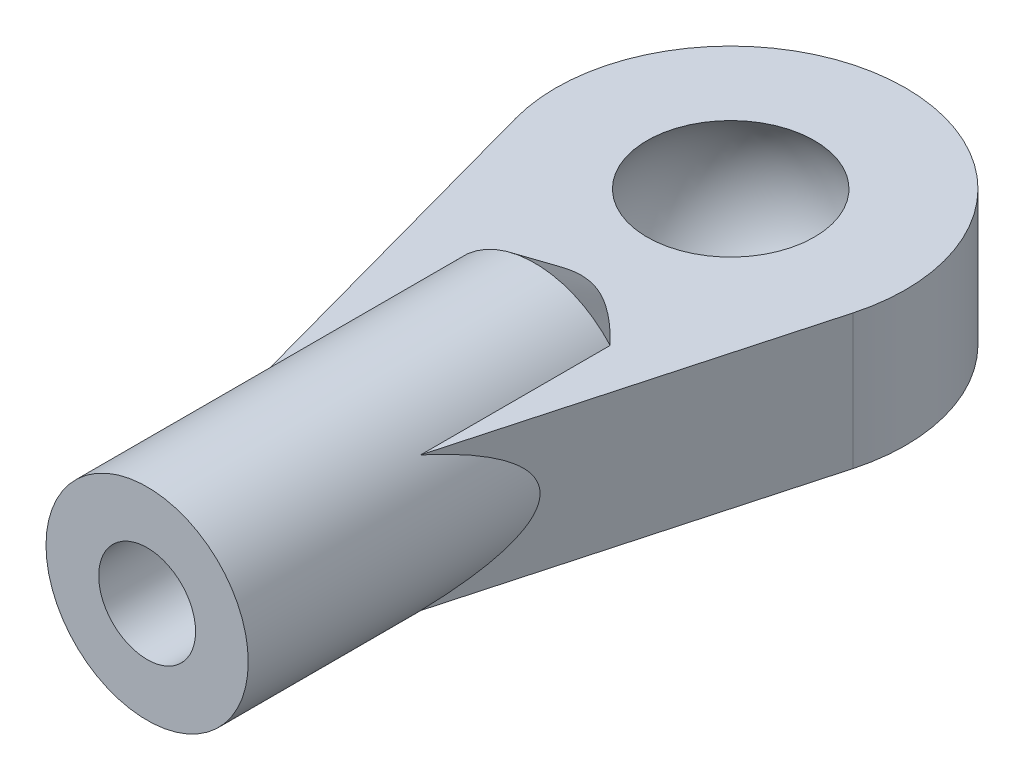
ISO-10303-21;
HEADER;
FILE_DESCRIPTION(('STEP AP214'),'2;1');
FILE_NAME('part.step','',(''),(''),'','','');
FILE_SCHEMA(('AUTOMOTIVE_DESIGN { 1 0 10303 214 1 1 1 1 }'));
ENDSEC;
DATA;
#1=APPLICATION_CONTEXT('core data for automotive mechanical design processes');
#2=APPLICATION_PROTOCOL_DEFINITION('international standard','automotive_design',2000,#1);
#3=PRODUCT_CONTEXT('',#1,'mechanical');
#4=PRODUCT('Part','Part','',(#3));
#5=PRODUCT_RELATED_PRODUCT_CATEGORY('part','',(#4));
#6=PRODUCT_DEFINITION_FORMATION('','',#4);
#7=PRODUCT_DEFINITION_CONTEXT('part definition',#1,'design');
#8=PRODUCT_DEFINITION('design','',#6,#7);
#9=PRODUCT_DEFINITION_SHAPE('','',#8);
#10=(LENGTH_UNIT() NAMED_UNIT(*) SI_UNIT(.MILLI.,.METRE.));
#11=(NAMED_UNIT(*) PLANE_ANGLE_UNIT() SI_UNIT($,.RADIAN.));
#12=(NAMED_UNIT(*) SI_UNIT($,.STERADIAN.) SOLID_ANGLE_UNIT());
#13=UNCERTAINTY_MEASURE_WITH_UNIT(LENGTH_MEASURE(1.E-05),#10,'distance_accuracy_value','');
#14=(GEOMETRIC_REPRESENTATION_CONTEXT(3) GLOBAL_UNCERTAINTY_ASSIGNED_CONTEXT((#13)) GLOBAL_UNIT_ASSIGNED_CONTEXT((#10,
#11,#12)) REPRESENTATION_CONTEXT('',''));
#15=CARTESIAN_POINT('',(0.,0.,0.));
#16=DIRECTION('',(0.,0.,1.));
#17=DIRECTION('',(1.,0.,0.));
#18=AXIS2_PLACEMENT_3D('',#15,#16,#17);
#19=CARTESIAN_POINT('',(1.98557296516648,1.6,0.));
#20=DIRECTION('',(0.,1.,0.));
#21=DIRECTION('',(0.,0.,1.));
#22=AXIS2_PLACEMENT_3D('',#19,#20,#21);
#23=PLANE('',#22);
#24=CARTESIAN_POINT('',(0.,1.6,0.));
#25=DIRECTION('',(0.,-1.,0.));
#26=DIRECTION('',(0.,0.,-1.));
#27=AXIS2_PLACEMENT_3D('',#24,#25,#26);
#28=CIRCLE('',#27,1.98557296516648);
#29=CARTESIAN_POINT('',(1.98557296516648,1.6,0.));
#30=VERTEX_POINT('',#29);
#31=EDGE_CURVE('E11',#30,#30,#28,.T.);
#32=ORIENTED_EDGE('',*,*,#31,.T.);
#33=EDGE_LOOP('',(#32));
#34=FACE_BOUND('',#33,.T.);
#35=DIRECTION('',(0.265108345024584,0.,0.964218629460314));
#36=VECTOR('',#35,1.);
#37=CARTESIAN_POINT('',(-2.4,1.6,6.925));
#38=LINE('',#37,#36);
#39=CARTESIAN_POINT('',(-4.0015073122603,1.6,1.10019963185203));
#40=VERTEX_POINT('',#39);
#41=CARTESIAN_POINT('',(-1.78885438199983,1.6,9.14778174658798));
#42=VERTEX_POINT('',#41);
#43=EDGE_CURVE('E145',#40,#42,#38,.T.);
#44=ORIENTED_EDGE('',*,*,#43,.T.);
#45=DIRECTION('',(0.,0.,1.));
#46=VECTOR('',#45,1.);
#47=CARTESIAN_POINT('',(-1.78885438199983,1.6,4.65));
#48=LINE('',#47,#46);
#49=CARTESIAN_POINT('',(-1.78885438199983,1.6,4.65));
#50=VERTEX_POINT('',#49);
#51=EDGE_CURVE('E148',#50,#42,#48,.T.);
#52=ORIENTED_EDGE('',*,*,#51,.F.);
#53=CARTESIAN_POINT('',(-3.32809527422648,1.6,6.42928336076321));
#54=CARTESIAN_POINT('',(-3.25740840476749,1.6,6.34160885984183));
#55=CARTESIAN_POINT('',(-3.18647464317426,1.6,6.25413191136492));
#56=CARTESIAN_POINT('',(-3.04398797565905,1.6,6.07967406521055));
#57=CARTESIAN_POINT('',(-2.97243502802624,1.6,5.99269320161656));
#58=CARTESIAN_POINT('',(-2.82839579161192,1.6,5.81910129645158));
#59=CARTESIAN_POINT('',(-2.75590747260073,1.6,5.73249193702244));
#60=CARTESIAN_POINT('',(-2.61002729059965,1.6,5.56004115878007));
#61=CARTESIAN_POINT('',(-2.53663545640642,1.6,5.47419971564175));
#62=CARTESIAN_POINT('',(-2.38535254436316,1.6,5.29959132057733));
#63=CARTESIAN_POINT('',(-2.30740901985387,1.6,5.21086970814048));
#64=CARTESIAN_POINT('',(-2.14995912885733,1.6,5.03482530272149));
#65=CARTESIAN_POINT('',(-2.07045282166961,1.6,4.94750245689071));
#66=CARTESIAN_POINT('',(-1.90949586266849,1.6,4.77485038968697));
#67=CARTESIAN_POINT('',(-1.82804757844161,1.6,4.6895189688683));
#68=CARTESIAN_POINT('',(-1.66246306648709,1.6,4.52151609669431));
#69=CARTESIAN_POINT('',(-1.57832743738984,1.6,4.4388440610596));
#70=CARTESIAN_POINT('',(-1.43282584739156,1.6,4.30225482490929));
#71=CARTESIAN_POINT('',(-1.37242074315023,1.6,4.24731799266033));
#72=CARTESIAN_POINT('',(-1.24934790906652,1.6,4.1399581127653));
#73=CARTESIAN_POINT('',(-1.18667912103876,1.6,4.08753626814962));
#74=CARTESIAN_POINT('',(-1.05893880870653,1.6,3.98655086785192));
#75=CARTESIAN_POINT('',(-0.993885540746542,1.6,3.93796445719715));
#76=CARTESIAN_POINT('',(-0.860343771627839,1.6,3.84581392290894));
#77=CARTESIAN_POINT('',(-0.791858657817134,1.6,3.80224498172568));
#78=CARTESIAN_POINT('',(-0.652735864121901,1.6,3.72354564303423));
#79=CARTESIAN_POINT('',(-0.582218452038707,1.6,3.68820693062372));
#80=CARTESIAN_POINT('',(-0.436900702576425,1.6,3.62755031199775));
#81=CARTESIAN_POINT('',(-0.362106705198783,1.6,3.60221799081262));
#82=CARTESIAN_POINT('',(-0.246797039780545,1.6,3.57431258554671));
#83=CARTESIAN_POINT('',(-0.207492539865301,1.6,3.56667242186748));
#84=CARTESIAN_POINT('',(-0.128330919765842,1.6,3.55530396031901));
#85=CARTESIAN_POINT('',(-0.0884741260761729,1.6,3.55157344346073));
#86=CARTESIAN_POINT('',(-0.00863613212186914,1.6,3.54824311424331));
#87=CARTESIAN_POINT('',(0.0313448395711053,1.6,3.54863794758123));
#88=CARTESIAN_POINT('',(0.111046985817861,1.6,3.55350925089506));
#89=CARTESIAN_POINT('',(0.150768133308623,1.6,3.55798613944418));
#90=CARTESIAN_POINT('',(0.27175498526633,1.6,3.5776651474584));
#91=CARTESIAN_POINT('',(0.352042784804189,1.6,3.5992164521965));
#92=CARTESIAN_POINT('',(0.468998001759893,1.6,3.64095434469174));
#93=CARTESIAN_POINT('',(0.50749108178793,1.6,3.65648372316395));
#94=CARTESIAN_POINT('',(0.583322079504167,1.6,3.69016822794667));
#95=CARTESIAN_POINT('',(0.620660008265836,1.6,3.70832332907709));
#96=CARTESIAN_POINT('',(0.749464996281795,1.6,3.77567872359347));
#97=CARTESIAN_POINT('',(0.837960238560091,1.6,3.83053502304846));
#98=CARTESIAN_POINT('',(1.00932815879972,1.6,3.94846041716161));
#99=CARTESIAN_POINT('',(1.09218801411238,1.6,4.01154734719936));
#100=CARTESIAN_POINT('',(1.25470334592205,1.6,4.14380142496116));
#101=CARTESIAN_POINT('',(1.3343016682226,1.6,4.21303818148327));
#102=CARTESIAN_POINT('',(1.45119263342751,1.6,4.3195147870875));
#103=CARTESIAN_POINT('',(1.48971934732714,1.6,4.35542474250267));
#104=CARTESIAN_POINT('',(1.56606122762418,1.6,4.42799187791643));
#105=CARTESIAN_POINT('',(1.60387642248238,1.6,4.46464902790449));
#106=CARTESIAN_POINT('',(1.72985279044113,1.6,4.5888036187823));
#107=CARTESIAN_POINT('',(1.81661943048353,1.6,4.67771530081166));
#108=CARTESIAN_POINT('',(1.98767537623552,1.6,4.85789768536102));
#109=CARTESIAN_POINT('',(2.07196425963643,1.6,4.94916878509477));
#110=CARTESIAN_POINT('',(2.23871053136241,1.6,5.13344853725683));
#111=CARTESIAN_POINT('',(2.32116697221002,1.6,5.22645804479708));
#112=CARTESIAN_POINT('',(2.48463542255061,1.6,5.41373992652123));
#113=CARTESIAN_POINT('',(2.56564737652004,1.6,5.50801234900649));
#114=CARTESIAN_POINT('',(2.80740265716277,1.6,5.79273443014875));
#115=CARTESIAN_POINT('',(2.96644995625352,1.6,5.98462250874654));
#116=CARTESIAN_POINT('',(3.28158296016944,1.6,6.37070176685717));
#117=CARTESIAN_POINT('',(3.43766955145876,1.6,6.56489222778596));
#118=CARTESIAN_POINT('',(3.72954930138269,1.6,6.93188627188002));
#119=CARTESIAN_POINT('',(3.86556572766512,1.6,7.10451254275787));
#120=CARTESIAN_POINT('',(4.13644441420727,1.6,7.45069268790489));
#121=CARTESIAN_POINT('',(4.27130656649579,1.6,7.6242466465361));
#122=CARTESIAN_POINT('',(4.53952106603734,1.6,7.97123671653446));
#123=CARTESIAN_POINT('',(4.67287751073763,1.6,8.14466966400147));
#124=CARTESIAN_POINT('',(4.93887648635051,1.6,8.4920515998051));
#125=CARTESIAN_POINT('',(5.07151909543661,1.6,8.66600052826046));
#126=CARTESIAN_POINT('',(5.20390283456072,1.6,8.84014504241839));
#127=B_SPLINE_CURVE_WITH_KNOTS('',3,(#53,#54,#55,#56,#57,#58,#59,#60,#61,#62,#63,#64,#65,#66,
#67,#68,#69,#70,#71,#72,#73,#74,#75,#76,#77,#78,#79,#80,#81,#82,#83,#84,#85,#86,#87,#88,#89,#90,
#91,#92,#93,#94,#95,#96,#97,#98,#99,#100,#101,#102,#103,#104,#105,#106,#107,#108,#109,#110,#111,
#112,#113,#114,#115,#116,#117,#118,#119,#120,#121,#122,#123,#124,#125,#126),.UNSPECIFIED.,.F.,
.F.,(4,2,2,2,2,2,2,2,2,2,2,2,2,2,2,2,2,2,2,2,2,2,2,2,2,2,2,2,2,2,2,2,2,2,2,2,4),(0.,
0.337863794824537,0.675750529474258,1.01456937334632,1.35337744626358,1.70765224915636,
2.06191363500281,2.41576321851408,2.76953452113753,3.01443598086192,3.25945344308273,
3.50287899226427,3.74606883129397,3.9821963458859,4.21798244927402,4.33793490609488,
4.45781924485109,4.5775480047556,4.69728904300646,4.94502568218679,5.06948776462178,
5.1939486535729,5.50543394675945,5.81760578673989,6.13392251874229,6.29191830911773,
6.44990776616081,6.82252819513432,7.19521176954625,7.56808375851436,7.94097004926592,
8.68861584921162,9.43603414613455,10.0953471989248,10.7547212644844,11.411047269718,
12.0672998739101),.UNSPECIFIED.);
#128=CARTESIAN_POINT('',(1.78885438199983,1.6,4.65));
#129=VERTEX_POINT('',#128);
#130=EDGE_CURVE('E114',#50,#129,#127,.T.);
#131=ORIENTED_EDGE('',*,*,#130,.T.);
#132=DIRECTION('',(0.,0.,1.));
#133=VECTOR('',#132,1.);
#134=CARTESIAN_POINT('',(1.78885438199983,1.6,4.65));
#135=LINE('',#134,#133);
#136=CARTESIAN_POINT('',(1.78885438199983,1.6,9.147781746588));
#137=VERTEX_POINT('',#136);
#138=EDGE_CURVE('E157',#137,#129,#135,.F.);
#139=ORIENTED_EDGE('',*,*,#138,.F.);
#140=DIRECTION('',(0.265108345024584,0.,-0.964218629460314));
#141=VECTOR('',#140,1.);
#142=CARTESIAN_POINT('',(2.4,1.6,6.925));
#143=LINE('',#142,#141);
#144=CARTESIAN_POINT('',(4.0015073122603,1.6,1.10019963185202));
#145=VERTEX_POINT('',#144);
#146=EDGE_CURVE('E54',#137,#145,#143,.T.);
#147=ORIENTED_EDGE('',*,*,#146,.T.);
#148=CARTESIAN_POINT('',(0.,1.6,0.));
#149=DIRECTION('',(0.,-1.,0.));
#150=DIRECTION('',(0.,0.,-1.));
#151=AXIS2_PLACEMENT_3D('',#148,#149,#150);
#152=CIRCLE('',#151,4.15);
#153=EDGE_CURVE('E42',#40,#145,#152,.T.);
#154=ORIENTED_EDGE('',*,*,#153,.F.);
#155=EDGE_LOOP('',(#44,#52,#131,#139,#147,#154));
#156=FACE_BOUND('',#155,.T.);
#157=ADVANCED_FACE('F34',(#34,#156),#23,.T.);
#158=CARTESIAN_POINT('',(1.98557296516648,-1.6,0.));
#159=DIRECTION('',(0.,-1.,0.));
#160=DIRECTION('',(0.,0.,-1.));
#161=AXIS2_PLACEMENT_3D('',#158,#159,#160);
#162=PLANE('',#161);
#163=CARTESIAN_POINT('',(0.,-1.6,0.));
#164=DIRECTION('',(0.,-1.,0.));
#165=DIRECTION('',(0.,0.,-1.));
#166=AXIS2_PLACEMENT_3D('',#163,#164,#165);
#167=CIRCLE('',#166,1.98557296516648);
#168=CARTESIAN_POINT('',(1.98557296516648,-1.6,0.));
#169=VERTEX_POINT('',#168);
#170=EDGE_CURVE('E165',#169,#169,#167,.T.);
#171=ORIENTED_EDGE('',*,*,#170,.F.);
#172=EDGE_LOOP('',(#171));
#173=FACE_BOUND('',#172,.T.);
#174=DIRECTION('',(0.265108345024584,0.,-0.964218629460314));
#175=VECTOR('',#174,1.);
#176=CARTESIAN_POINT('',(2.4,-1.6,6.925));
#177=LINE('',#176,#175);
#178=CARTESIAN_POINT('',(1.78885438199983,-1.6,9.147781746588));
#179=VERTEX_POINT('',#178);
#180=CARTESIAN_POINT('',(4.0015073122603,-1.6,1.10019963185202));
#181=VERTEX_POINT('',#180);
#182=EDGE_CURVE('E160',#179,#181,#177,.T.);
#183=ORIENTED_EDGE('',*,*,#182,.F.);
#184=DIRECTION('',(0.,0.,1.));
#185=VECTOR('',#184,1.);
#186=CARTESIAN_POINT('',(1.78885438199983,-1.6,4.65));
#187=LINE('',#186,#185);
#188=CARTESIAN_POINT('',(1.78885438199983,-1.6,4.65));
#189=VERTEX_POINT('',#188);
#190=EDGE_CURVE('E183',#189,#179,#187,.T.);
#191=ORIENTED_EDGE('',*,*,#190,.F.);
#192=CARTESIAN_POINT('',(-3.32809527422648,-1.6,6.42928336076321));
#193=CARTESIAN_POINT('',(-3.25740840476749,-1.6,6.34160885984183));
#194=CARTESIAN_POINT('',(-3.18647464317426,-1.6,6.25413191136492));
#195=CARTESIAN_POINT('',(-3.04398797565905,-1.6,6.07967406521055));
#196=CARTESIAN_POINT('',(-2.97243502802624,-1.6,5.99269320161656));
#197=CARTESIAN_POINT('',(-2.82839579161192,-1.6,5.81910129645158));
#198=CARTESIAN_POINT('',(-2.75590747260073,-1.6,5.73249193702244));
#199=CARTESIAN_POINT('',(-2.61002729059965,-1.6,5.56004115878007));
#200=CARTESIAN_POINT('',(-2.53663545640642,-1.6,5.47419971564175));
#201=CARTESIAN_POINT('',(-2.38535254436316,-1.6,5.29959132057733));
#202=CARTESIAN_POINT('',(-2.30740901985387,-1.6,5.21086970814048));
#203=CARTESIAN_POINT('',(-2.14995912885733,-1.6,5.03482530272149));
#204=CARTESIAN_POINT('',(-2.07045282166961,-1.6,4.94750245689071));
#205=CARTESIAN_POINT('',(-1.90949586266849,-1.6,4.77485038968697));
#206=CARTESIAN_POINT('',(-1.82804757844161,-1.6,4.6895189688683));
#207=CARTESIAN_POINT('',(-1.66246306648709,-1.6,4.52151609669431));
#208=CARTESIAN_POINT('',(-1.57832743738984,-1.6,4.4388440610596));
#209=CARTESIAN_POINT('',(-1.43282584739156,-1.6,4.30225482490929));
#210=CARTESIAN_POINT('',(-1.37242074315023,-1.6,4.24731799266033));
#211=CARTESIAN_POINT('',(-1.24934790906652,-1.6,4.1399581127653));
#212=CARTESIAN_POINT('',(-1.18667912103876,-1.6,4.08753626814962));
#213=CARTESIAN_POINT('',(-1.05893880870653,-1.6,3.98655086785192));
#214=CARTESIAN_POINT('',(-0.993885540746542,-1.6,3.93796445719715));
#215=CARTESIAN_POINT('',(-0.860343771627839,-1.6,3.84581392290894));
#216=CARTESIAN_POINT('',(-0.791858657817134,-1.6,3.80224498172568));
#217=CARTESIAN_POINT('',(-0.652735864121901,-1.6,3.72354564303423));
#218=CARTESIAN_POINT('',(-0.582218452038707,-1.6,3.68820693062372));
#219=CARTESIAN_POINT('',(-0.436900702576425,-1.6,3.62755031199775));
#220=CARTESIAN_POINT('',(-0.362106705198783,-1.6,3.60221799081262));
#221=CARTESIAN_POINT('',(-0.246797039780545,-1.6,3.57431258554671));
#222=CARTESIAN_POINT('',(-0.207492539865301,-1.6,3.56667242186748));
#223=CARTESIAN_POINT('',(-0.128330919765842,-1.6,3.55530396031901));
#224=CARTESIAN_POINT('',(-0.0884741260761729,-1.6,3.55157344346073));
#225=CARTESIAN_POINT('',(-0.00863613212186914,-1.6,3.54824311424331));
#226=CARTESIAN_POINT('',(0.0313448395711053,-1.6,3.54863794758123));
#227=CARTESIAN_POINT('',(0.111046985817861,-1.6,3.55350925089506));
#228=CARTESIAN_POINT('',(0.150768133308623,-1.6,3.55798613944418));
#229=CARTESIAN_POINT('',(0.27175498526633,-1.6,3.5776651474584));
#230=CARTESIAN_POINT('',(0.352042784804189,-1.6,3.5992164521965));
#231=CARTESIAN_POINT('',(0.468998001759893,-1.6,3.64095434469174));
#232=CARTESIAN_POINT('',(0.50749108178793,-1.6,3.65648372316395));
#233=CARTESIAN_POINT('',(0.583322079504167,-1.6,3.69016822794667));
#234=CARTESIAN_POINT('',(0.620660008265836,-1.6,3.70832332907709));
#235=CARTESIAN_POINT('',(0.749464996281795,-1.6,3.77567872359347));
#236=CARTESIAN_POINT('',(0.837960238560091,-1.6,3.83053502304846));
#237=CARTESIAN_POINT('',(1.00932815879972,-1.6,3.94846041716161));
#238=CARTESIAN_POINT('',(1.09218801411238,-1.6,4.01154734719936));
#239=CARTESIAN_POINT('',(1.25470334592205,-1.6,4.14380142496116));
#240=CARTESIAN_POINT('',(1.3343016682226,-1.6,4.21303818148327));
#241=CARTESIAN_POINT('',(1.45119263342751,-1.6,4.3195147870875));
#242=CARTESIAN_POINT('',(1.48971934732714,-1.6,4.35542474250267));
#243=CARTESIAN_POINT('',(1.56606122762418,-1.6,4.42799187791643));
#244=CARTESIAN_POINT('',(1.60387642248238,-1.6,4.46464902790449));
#245=CARTESIAN_POINT('',(1.72985279044113,-1.6,4.5888036187823));
#246=CARTESIAN_POINT('',(1.81661943048353,-1.6,4.67771530081166));
#247=CARTESIAN_POINT('',(1.98767537623552,-1.6,4.85789768536102));
#248=CARTESIAN_POINT('',(2.07196425963643,-1.6,4.94916878509477));
#249=CARTESIAN_POINT('',(2.23871053136241,-1.6,5.13344853725683));
#250=CARTESIAN_POINT('',(2.32116697221002,-1.6,5.22645804479708));
#251=CARTESIAN_POINT('',(2.48463542255061,-1.6,5.41373992652123));
#252=CARTESIAN_POINT('',(2.56564737652004,-1.6,5.50801234900649));
#253=CARTESIAN_POINT('',(2.80740265716277,-1.6,5.79273443014875));
#254=CARTESIAN_POINT('',(2.96644995625352,-1.6,5.98462250874654));
#255=CARTESIAN_POINT('',(3.28158296016944,-1.6,6.37070176685717));
#256=CARTESIAN_POINT('',(3.43766955145876,-1.6,6.56489222778596));
#257=CARTESIAN_POINT('',(3.72954930138269,-1.6,6.93188627188002));
#258=CARTESIAN_POINT('',(3.86556572766512,-1.6,7.10451254275787));
#259=CARTESIAN_POINT('',(4.13644441420727,-1.6,7.45069268790489));
#260=CARTESIAN_POINT('',(4.27130656649579,-1.6,7.6242466465361));
#261=CARTESIAN_POINT('',(4.53952106603734,-1.6,7.97123671653446));
#262=CARTESIAN_POINT('',(4.67287751073763,-1.6,8.14466966400147));
#263=CARTESIAN_POINT('',(4.93887648635051,-1.6,8.4920515998051));
#264=CARTESIAN_POINT('',(5.07151909543661,-1.6,8.66600052826046));
#265=CARTESIAN_POINT('',(5.20390283456072,-1.6,8.84014504241839));
#266=B_SPLINE_CURVE_WITH_KNOTS('',3,(#192,#193,#194,#195,#196,#197,#198,#199,#200,#201,#202,
#203,#204,#205,#206,#207,#208,#209,#210,#211,#212,#213,#214,#215,#216,#217,#218,#219,#220,#221,
#222,#223,#224,#225,#226,#227,#228,#229,#230,#231,#232,#233,#234,#235,#236,#237,#238,#239,#240,
#241,#242,#243,#244,#245,#246,#247,#248,#249,#250,#251,#252,#253,#254,#255,#256,#257,#258,#259,
#260,#261,#262,#263,#264,#265),.UNSPECIFIED.,.F.,.F.,(4,2,2,2,2,2,2,2,2,2,2,2,2,2,2,2,2,2,2,2,2,
2,2,2,2,2,2,2,2,2,2,2,2,2,2,2,4),(0.,0.337863794824537,0.675750529474258,1.01456937334632,
1.35337744626358,1.70765224915636,2.06191363500281,2.41576321851408,2.76953452113753,
3.01443598086192,3.25945344308273,3.50287899226427,3.74606883129397,3.9821963458859,
4.21798244927402,4.33793490609488,4.45781924485109,4.5775480047556,4.69728904300646,
4.94502568218679,5.06948776462178,5.1939486535729,5.50543394675945,5.81760578673989,
6.13392251874229,6.29191830911773,6.44990776616081,6.82252819513432,7.19521176954625,
7.56808375851436,7.94097004926592,8.68861584921162,9.43603414613455,10.0953471989248,
10.7547212644844,11.411047269718,12.0672998739101),.UNSPECIFIED.);
#267=CARTESIAN_POINT('',(-1.78885438199983,-1.6,4.65));
#268=VERTEX_POINT('',#267);
#269=EDGE_CURVE('E105',#189,#268,#266,.F.);
#270=ORIENTED_EDGE('',*,*,#269,.T.);
#271=DIRECTION('',(0.,0.,1.));
#272=VECTOR('',#271,1.);
#273=CARTESIAN_POINT('',(-1.78885438199983,-1.6,4.65));
#274=LINE('',#273,#272);
#275=CARTESIAN_POINT('',(-1.78885438199983,-1.6,9.14778174658798));
#276=VERTEX_POINT('',#275);
#277=EDGE_CURVE('E177',#276,#268,#274,.F.);
#278=ORIENTED_EDGE('',*,*,#277,.F.);
#279=DIRECTION('',(0.265108345024584,0.,0.964218629460314));
#280=VECTOR('',#279,1.);
#281=CARTESIAN_POINT('',(-2.4,-1.6,6.925));
#282=LINE('',#281,#280);
#283=CARTESIAN_POINT('',(-4.0015073122603,-1.6,1.10019963185203));
#284=VERTEX_POINT('',#283);
#285=EDGE_CURVE('E155',#284,#276,#282,.T.);
#286=ORIENTED_EDGE('',*,*,#285,.F.);
#287=CARTESIAN_POINT('',(0.,-1.6,0.));
#288=DIRECTION('',(0.,-1.,0.));
#289=DIRECTION('',(0.,0.,-1.));
#290=AXIS2_PLACEMENT_3D('',#287,#288,#289);
#291=CIRCLE('',#290,4.15);
#292=EDGE_CURVE('E170',#284,#181,#291,.T.);
#293=ORIENTED_EDGE('',*,*,#292,.T.);
#294=EDGE_LOOP('',(#183,#191,#270,#278,#286,#293));
#295=FACE_BOUND('',#294,.T.);
#296=ADVANCED_FACE('F122',(#173,#295),#162,.T.);
#297=CARTESIAN_POINT('',(-2.4,-1.6,13.85));
#298=DIRECTION('',(0.,0.,1.));
#299=DIRECTION('',(1.,0.,0.));
#300=AXIS2_PLACEMENT_3D('',#297,#298,#299);
#301=PLANE('',#300);
#302=CARTESIAN_POINT('',(0.,0.,13.85));
#303=DIRECTION('',(0.,0.,1.));
#304=DIRECTION('',(1.,0.,0.));
#305=AXIS2_PLACEMENT_3D('',#302,#303,#304);
#306=CIRCLE('',#305,1.15);
#307=CARTESIAN_POINT('',(1.15,0.,13.85));
#308=VERTEX_POINT('',#307);
#309=EDGE_CURVE('E97',#308,#308,#306,.T.);
#310=ORIENTED_EDGE('',*,*,#309,.F.);
#311=EDGE_LOOP('',(#310));
#312=FACE_BOUND('',#311,.T.);
#313=CARTESIAN_POINT('',(0.,0.,13.85));
#314=DIRECTION('',(0.,0.,1.));
#315=DIRECTION('',(1.,0.,0.));
#316=AXIS2_PLACEMENT_3D('',#313,#314,#315);
#317=CIRCLE('',#316,2.4);
#318=CARTESIAN_POINT('',(2.4,0.,13.85));
#319=VERTEX_POINT('',#318);
#320=EDGE_CURVE('E191',#319,#319,#317,.T.);
#321=ORIENTED_EDGE('',*,*,#320,.T.);
#322=EDGE_LOOP('',(#321));
#323=FACE_BOUND('',#322,.T.);
#324=ADVANCED_FACE('F127',(#312,#323),#301,.T.);
#325=CARTESIAN_POINT('',(0.,0.,0.));
#326=DIRECTION('',(0.,-1.,0.));
#327=DIRECTION('',(1.,0.,0.));
#328=AXIS2_PLACEMENT_3D('',#325,#326,#327);
#329=SPHERICAL_SURFACE('',#328,2.55);
#330=CARTESIAN_POINT('',(1.98557296516648,-1.6,0.));
#331=CARTESIAN_POINT('',(2.00818253673827,-1.57194268857942,0.));
#332=CARTESIAN_POINT('',(2.03019662051297,-1.54340557196934,0.));
#333=CARTESIAN_POINT('',(2.07299599824218,-1.48542429010499,0.));
#334=CARTESIAN_POINT('',(2.09378129219668,-1.45598012485073,0.));
#335=CARTESIAN_POINT('',(2.13408527605943,-1.39623730743284,0.));
#336=CARTESIAN_POINT('',(2.15360396596768,-1.36593865526922,0.));
#337=CARTESIAN_POINT('',(2.19133979499587,-1.30454139784181,0.));
#338=CARTESIAN_POINT('',(2.20955693411582,-1.27344279257804,0.));
#339=CARTESIAN_POINT('',(2.24465689496867,-1.21050148312392,0.));
#340=CARTESIAN_POINT('',(2.26153971670157,-1.17865877893357,0.));
#341=CARTESIAN_POINT('',(2.29394071619873,-1.11428649417316,0.));
#342=CARTESIAN_POINT('',(2.30945889396298,-1.0817569136031,0.));
#343=CARTESIAN_POINT('',(2.33910271959286,-1.0160693244288,0.));
#344=CARTESIAN_POINT('',(2.35322836745849,-0.982911315824553,0.));
#345=CARTESIAN_POINT('',(2.38006175255004,-0.916026450356764,0.));
#346=CARTESIAN_POINT('',(2.39276948977595,-0.882299593493221,0.));
#347=CARTESIAN_POINT('',(2.41674421977401,-0.814337632802064,0.));
#348=CARTESIAN_POINT('',(2.42801121254614,-0.78010252897445,0.));
#349=CARTESIAN_POINT('',(2.44908420881411,-0.711185589045311,0.));
#350=CARTESIAN_POINT('',(2.45889021230994,-0.676503752943785,0.));
#351=CARTESIAN_POINT('',(2.47702361029327,-0.606755665815554,0.));
#352=CARTESIAN_POINT('',(2.48535100478075,-0.571689414788848,0.));
#353=CARTESIAN_POINT('',(2.50051222183983,-0.501235505898799,0.));
#354=CARTESIAN_POINT('',(2.50734604441141,-0.465847848035455,0.));
#355=CARTESIAN_POINT('',(2.51950783842151,-0.394814711070956,0.));
#356=CARTESIAN_POINT('',(2.52483580986001,-0.359169231969801,0.));
#357=CARTESIAN_POINT('',(2.53397632814612,-0.287684501390231,0.));
#358=CARTESIAN_POINT('',(2.53778887499374,-0.251845249911817,0.));
#359=CARTESIAN_POINT('',(2.54389169360008,-0.180037371614048,0.));
#360=CARTESIAN_POINT('',(2.54618196535881,-0.144068744794693,0.));
#361=CARTESIAN_POINT('',(2.54923611855877,-0.0720667453168917,0.));
#362=CARTESIAN_POINT('',(2.55,-0.0360333726584457,0.));
#363=CARTESIAN_POINT('',(2.55,0.0360333726584463,0.));
#364=CARTESIAN_POINT('',(2.54923611855877,0.0720667453168922,0.));
#365=CARTESIAN_POINT('',(2.54618196535881,0.144068744794693,0.));
#366=CARTESIAN_POINT('',(2.54389169360008,0.180037371614049,0.));
#367=CARTESIAN_POINT('',(2.53778887499374,0.251845249911818,0.));
#368=CARTESIAN_POINT('',(2.53397632814612,0.287684501390232,0.));
#369=CARTESIAN_POINT('',(2.52483580986001,0.359169231969801,0.));
#370=CARTESIAN_POINT('',(2.5195078384215,0.394814711070956,0.));
#371=CARTESIAN_POINT('',(2.50734604441141,0.465847848035455,0.));
#372=CARTESIAN_POINT('',(2.50051222183983,0.501235505898799,0.));
#373=CARTESIAN_POINT('',(2.48535100478075,0.571689414788849,0.));
#374=CARTESIAN_POINT('',(2.47702361029327,0.606755665815554,0.));
#375=CARTESIAN_POINT('',(2.45889021230994,0.676503752943786,0.));
#376=CARTESIAN_POINT('',(2.44908420881411,0.711185589045311,0.));
#377=CARTESIAN_POINT('',(2.42801121254614,0.780102528974451,0.));
#378=CARTESIAN_POINT('',(2.41674421977401,0.814337632802065,0.));
#379=CARTESIAN_POINT('',(2.39276948977595,0.882299593493222,0.));
#380=CARTESIAN_POINT('',(2.38006175255003,0.916026450356765,0.));
#381=CARTESIAN_POINT('',(2.35322836745849,0.982911315824553,0.));
#382=CARTESIAN_POINT('',(2.33910271959286,1.0160693244288,0.));
#383=CARTESIAN_POINT('',(2.30945889396298,1.0817569136031,0.));
#384=CARTESIAN_POINT('',(2.29394071619873,1.11428649417316,0.));
#385=CARTESIAN_POINT('',(2.26153971670157,1.17865877893357,0.));
#386=CARTESIAN_POINT('',(2.24465689496867,1.21050148312392,0.));
#387=CARTESIAN_POINT('',(2.20955693411582,1.27344279257804,0.));
#388=CARTESIAN_POINT('',(2.19133979499587,1.30454139784181,0.));
#389=CARTESIAN_POINT('',(2.15360396596768,1.36593865526922,0.));
#390=CARTESIAN_POINT('',(2.13408527605943,1.39623730743284,0.));
#391=CARTESIAN_POINT('',(2.09378129219668,1.45598012485073,0.));
#392=CARTESIAN_POINT('',(2.07299599824218,1.48542429010499,0.));
#393=CARTESIAN_POINT('',(2.03019662051297,1.54340557196934,0.));
#394=CARTESIAN_POINT('',(2.00818253673827,1.57194268857942,0.));
#395=CARTESIAN_POINT('',(1.98557296516648,1.6,0.));
#396=B_SPLINE_CURVE_WITH_KNOTS('',3,(#330,#331,#332,#333,#334,#335,#336,#337,#338,#339,#340,
#341,#342,#343,#344,#345,#346,#347,#348,#349,#350,#351,#352,#353,#354,#355,#356,#357,#358,#359,
#360,#361,#362,#363,#364,#365,#366,#367,#368,#369,#370,#371,#372,#373,#374,#375,#376,#377,#378,
#379,#380,#381,#382,#383,#384,#385,#386,#387,#388,#389,#390,#391,#392,#393,#394,#395),
.UNSPECIFIED.,.F.,.F.,(4,2,2,2,2,2,2,2,2,2,2,2,2,2,2,2,2,2,2,2,2,2,2,2,2,2,2,2,2,2,2,2,4),(0.,
0.10809202565495,0.2161840513099,0.32427607696485,0.4323681026198,0.54046012827475,
0.6485521539297,0.75664417958465,0.8647362052396,0.97282823089455,1.0809202565495,
1.18901228220445,1.2971043078594,1.40519633351435,1.5132883591693,1.62138038482425,
1.7294724104792,1.83756443613415,1.9456564617891,2.05374848744405,2.161840513099,
2.26993253875395,2.3780245644089,2.48611659006385,2.5942086157188,2.70230064137375,
2.8103926670287,2.91848469268365,3.0265767183386,3.13466874399355,3.2427607696485,
3.35085279530345,3.4589448209584),.UNSPECIFIED.);
#397=EDGE_CURVE('BSEAM36',#169,#30,#396,.T.);
#398=ORIENTED_EDGE('',*,*,#170,.T.);
#399=ORIENTED_EDGE('',*,*,#31,.F.);
#400=ORIENTED_EDGE('',*,*,#397,.T.);
#401=ORIENTED_EDGE('',*,*,#397,.F.);
#402=EDGE_LOOP('',(#398,#400,#399,#401));
#403=FACE_BOUND('',#402,.T.);
#404=ADVANCED_FACE('F36',(#403),#329,.F.);
#405=CARTESIAN_POINT('',(0.,0.,0.));
#406=DIRECTION('',(0.,-1.,0.));
#407=DIRECTION('',(0.,0.,-1.));
#408=AXIS2_PLACEMENT_3D('',#405,#406,#407);
#409=CYLINDRICAL_SURFACE('',#408,4.15);
#410=DIRECTION('',(0.,1.,0.));
#411=VECTOR('',#410,1.);
#412=CARTESIAN_POINT('',(4.0015073122603,-1.6,1.10019963185202));
#413=LINE('',#412,#411);
#414=EDGE_CURVE('E163',#181,#145,#413,.T.);
#415=ORIENTED_EDGE('',*,*,#414,.F.);
#416=ORIENTED_EDGE('',*,*,#292,.F.);
#417=DIRECTION('',(0.,1.,0.));
#418=VECTOR('',#417,1.);
#419=CARTESIAN_POINT('',(-4.0015073122603,-1.6,1.10019963185203));
#420=LINE('',#419,#418);
#421=EDGE_CURVE('E166',#284,#40,#420,.T.);
#422=ORIENTED_EDGE('',*,*,#421,.T.);
#423=ORIENTED_EDGE('',*,*,#153,.T.);
#424=EDGE_LOOP('',(#415,#416,#422,#423));
#425=FACE_BOUND('',#424,.T.);
#426=ADVANCED_FACE('F131',(#425),#409,.T.);
#427=CARTESIAN_POINT('',(2.4,-1.6,6.925));
#428=DIRECTION('',(0.964218629460314,0.,0.265108345024584));
#429=DIRECTION('',(0.265108345024584,0.,-0.964218629460314));
#430=AXIS2_PLACEMENT_3D('',#427,#428,#429);
#431=PLANE('',#430);
#432=ORIENTED_EDGE('',*,*,#146,.F.);
#433=CARTESIAN_POINT('',(0.,0.,15.6539772432104));
#434=DIRECTION('',(0.964218629460314,0.,0.265108345024584));
#435=DIRECTION('',(-0.265108345024584,0.,0.964218629460314));
#436=AXIS2_PLACEMENT_3D('',#433,#434,#435);
#437=ELLIPSE('',#436,9.05290250209758,2.4);
#438=EDGE_CURVE('E49',#137,#179,#437,.F.);
#439=ORIENTED_EDGE('',*,*,#438,.T.);
#440=ORIENTED_EDGE('',*,*,#182,.T.);
#441=ORIENTED_EDGE('',*,*,#414,.T.);
#442=EDGE_LOOP('',(#432,#439,#440,#441));
#443=FACE_BOUND('',#442,.T.);
#444=ADVANCED_FACE('F133',(#443),#431,.T.);
#445=CARTESIAN_POINT('',(-2.4,-1.6,6.925));
#446=DIRECTION('',(-0.964218629460314,0.,0.265108345024584));
#447=DIRECTION('',(0.265108345024585,0.,0.964218629460314));
#448=AXIS2_PLACEMENT_3D('',#445,#446,#447);
#449=PLANE('',#448);
#450=ORIENTED_EDGE('',*,*,#43,.F.);
#451=ORIENTED_EDGE('',*,*,#421,.F.);
#452=ORIENTED_EDGE('',*,*,#285,.T.);
#453=CARTESIAN_POINT('',(0.,0.,15.6539772432103));
#454=DIRECTION('',(-0.964218629460314,0.,0.265108345024585));
#455=DIRECTION('',(0.265108345024585,0.,0.964218629460314));
#456=AXIS2_PLACEMENT_3D('',#453,#454,#455);
#457=ELLIPSE('',#456,9.05290250209755,2.4);
#458=EDGE_CURVE('E99',#276,#42,#457,.F.);
#459=ORIENTED_EDGE('',*,*,#458,.T.);
#460=EDGE_LOOP('',(#450,#451,#452,#459));
#461=FACE_BOUND('',#460,.T.);
#462=ADVANCED_FACE('F129',(#461),#449,.T.);
#463=CARTESIAN_POINT('',(0.,0.,4.65));
#464=DIRECTION('',(0.,0.,1.));
#465=DIRECTION('',(1.,0.,0.));
#466=AXIS2_PLACEMENT_3D('',#463,#464,#465);
#467=CYLINDRICAL_SURFACE('',#466,2.4);
#468=ORIENTED_EDGE('',*,*,#190,.T.);
#469=ORIENTED_EDGE('',*,*,#438,.F.);
#470=ORIENTED_EDGE('',*,*,#138,.T.);
#471=CARTESIAN_POINT('',(0.,0.,4.65));
#472=DIRECTION('',(0.,0.,1.));
#473=DIRECTION('',(1.,0.,0.));
#474=AXIS2_PLACEMENT_3D('',#471,#472,#473);
#475=CIRCLE('',#474,2.4);
#476=EDGE_CURVE('E184',#129,#50,#475,.T.);
#477=ORIENTED_EDGE('',*,*,#476,.T.);
#478=ORIENTED_EDGE('',*,*,#51,.T.);
#479=ORIENTED_EDGE('',*,*,#458,.F.);
#480=ORIENTED_EDGE('',*,*,#277,.T.);
#481=EDGE_CURVE('E190',#268,#189,#475,.T.);
#482=ORIENTED_EDGE('',*,*,#481,.T.);
#483=EDGE_LOOP('',(#468,#469,#470,#477,#478,#479,#480,#482));
#484=FACE_BOUND('',#483,.T.);
#485=ORIENTED_EDGE('',*,*,#320,.F.);
#486=EDGE_LOOP('',(#485));
#487=FACE_BOUND('',#486,.T.);
#488=ADVANCED_FACE('F186',(#484,#487),#467,.T.);
#489=CARTESIAN_POINT('',(0.,0.,4.65));
#490=DIRECTION('',(0.,0.,1.));
#491=DIRECTION('',(-1.,0.,0.));
#492=AXIS2_PLACEMENT_3D('',#489,#490,#491);
#493=CONICAL_SURFACE('',#492,2.4,0.628318530717959);
#494=ORIENTED_EDGE('',*,*,#130,.F.);
#495=ORIENTED_EDGE('',*,*,#476,.F.);
#496=EDGE_LOOP('',(#494,#495));
#497=FACE_BOUND('',#496,.T.);
#498=ADVANCED_FACE('F196',(#497),#493,.T.);
#499=ORIENTED_EDGE('',*,*,#269,.F.);
#500=ORIENTED_EDGE('',*,*,#481,.F.);
#501=EDGE_LOOP('',(#499,#500));
#502=FACE_BOUND('',#501,.T.);
#503=ADVANCED_FACE('F91',(#502),#493,.T.);
#504=CARTESIAN_POINT('',(0.,0.,4.65));
#505=DIRECTION('',(0.,0.,1.));
#506=DIRECTION('',(1.,0.,0.));
#507=AXIS2_PLACEMENT_3D('',#504,#505,#506);
#508=CONICAL_SURFACE('',#507,1.15,1.02974425867665);
#509=CARTESIAN_POINT('',(0.,0.,3.9590102881183));
#510=VERTEX_POINT('',#509);
#511=VERTEX_LOOP('',#510);
#512=FACE_BOUND('',#511,.T.);
#513=CARTESIAN_POINT('',(0.,0.,4.65));
#514=DIRECTION('',(0.,0.,1.));
#515=DIRECTION('',(1.,0.,0.));
#516=AXIS2_PLACEMENT_3D('',#513,#514,#515);
#517=CIRCLE('',#516,1.15);
#518=CARTESIAN_POINT('',(1.15,0.,4.65));
#519=VERTEX_POINT('',#518);
#520=EDGE_CURVE('E95',#519,#519,#517,.T.);
#521=ORIENTED_EDGE('',*,*,#520,.T.);
#522=EDGE_LOOP('',(#521));
#523=FACE_BOUND('',#522,.T.);
#524=ADVANCED_FACE('F87',(#512,#523),#508,.F.);
#525=CARTESIAN_POINT('',(0.,0.,13.85));
#526=DIRECTION('',(0.,0.,1.));
#527=DIRECTION('',(1.,0.,0.));
#528=AXIS2_PLACEMENT_3D('',#525,#526,#527);
#529=CYLINDRICAL_SURFACE('',#528,1.15);
#530=ORIENTED_EDGE('',*,*,#520,.F.);
#531=EDGE_LOOP('',(#530));
#532=FACE_BOUND('',#531,.T.);
#533=ORIENTED_EDGE('',*,*,#309,.T.);
#534=EDGE_LOOP('',(#533));
#535=FACE_BOUND('',#534,.T.);
#536=ADVANCED_FACE('F90',(#532,#535),#529,.F.);
#537=CLOSED_SHELL('',(#157,#296,#324,#404,#426,#444,#462,#488,#498,#503,#524,#536));
#538=MANIFOLD_SOLID_BREP('B2',#537);
#539=ADVANCED_BREP_SHAPE_REPRESENTATION('',(#18,#538),#14);
#540=SHAPE_DEFINITION_REPRESENTATION(#9,#539);
ENDSEC;
END-ISO-10303-21;
